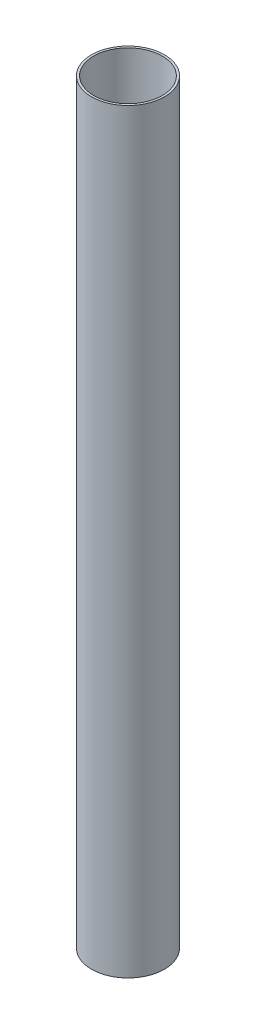
ISO-10303-21;
HEADER;
FILE_DESCRIPTION(('STEP AP214'),'2;1');
FILE_NAME('part.step','',(''),(''),'','','');
FILE_SCHEMA(('AUTOMOTIVE_DESIGN { 1 0 10303 214 1 1 1 1 }'));
ENDSEC;
DATA;
#1=APPLICATION_CONTEXT('core data for automotive mechanical design processes');
#2=APPLICATION_PROTOCOL_DEFINITION('international standard','automotive_design',2000,#1);
#3=PRODUCT_CONTEXT('',#1,'mechanical');
#4=PRODUCT('Part','Part','',(#3));
#5=PRODUCT_RELATED_PRODUCT_CATEGORY('part','',(#4));
#6=PRODUCT_DEFINITION_FORMATION('','',#4);
#7=PRODUCT_DEFINITION_CONTEXT('part definition',#1,'design');
#8=PRODUCT_DEFINITION('design','',#6,#7);
#9=PRODUCT_DEFINITION_SHAPE('','',#8);
#10=(LENGTH_UNIT() NAMED_UNIT(*) SI_UNIT(.MILLI.,.METRE.));
#11=(NAMED_UNIT(*) PLANE_ANGLE_UNIT() SI_UNIT($,.RADIAN.));
#12=(NAMED_UNIT(*) SI_UNIT($,.STERADIAN.) SOLID_ANGLE_UNIT());
#13=UNCERTAINTY_MEASURE_WITH_UNIT(LENGTH_MEASURE(1.E-05),#10,'distance_accuracy_value','');
#14=(GEOMETRIC_REPRESENTATION_CONTEXT(3) GLOBAL_UNCERTAINTY_ASSIGNED_CONTEXT((#13)) GLOBAL_UNIT_ASSIGNED_CONTEXT((#10,
#11,#12)) REPRESENTATION_CONTEXT('',''));
#15=CARTESIAN_POINT('',(0.,0.,0.));
#16=DIRECTION('',(0.,0.,1.));
#17=DIRECTION('',(1.,0.,0.));
#18=AXIS2_PLACEMENT_3D('',#15,#16,#17);
#19=CARTESIAN_POINT('',(0.,1146.81,0.));
#20=DIRECTION('',(0.,1.,0.));
#21=DIRECTION('',(0.,0.,1.));
#22=AXIS2_PLACEMENT_3D('',#19,#20,#21);
#23=CYLINDRICAL_SURFACE('',#22,49.5299999999999);
#24=CARTESIAN_POINT('',(0.,0.,0.));
#25=DIRECTION('',(0.,1.,0.));
#26=DIRECTION('',(0.,0.,1.));
#27=AXIS2_PLACEMENT_3D('',#24,#25,#26);
#28=CIRCLE('',#27,49.53);
#29=CARTESIAN_POINT('',(0.,0.,49.53));
#30=VERTEX_POINT('',#29);
#31=EDGE_CURVE('E10',#30,#30,#28,.T.);
#32=ORIENTED_EDGE('',*,*,#31,.F.);
#33=EDGE_LOOP('',(#32));
#34=FACE_BOUND('',#33,.T.);
#35=CARTESIAN_POINT('',(0.,1092.2,0.));
#36=DIRECTION('',(0.,1.,0.));
#37=DIRECTION('',(0.,0.,1.));
#38=AXIS2_PLACEMENT_3D('',#35,#36,#37);
#39=CIRCLE('',#38,49.5299999999999);
#40=CARTESIAN_POINT('',(0.,1092.2,49.5299999999999));
#41=VERTEX_POINT('',#40);
#42=EDGE_CURVE('E57',#41,#41,#39,.T.);
#43=ORIENTED_EDGE('',*,*,#42,.T.);
#44=EDGE_LOOP('',(#43));
#45=FACE_BOUND('',#44,.T.);
#46=ADVANCED_FACE('F40',(#34,#45),#23,.F.);
#47=CARTESIAN_POINT('',(49.53,0.,0.));
#48=DIRECTION('',(0.,1.,0.));
#49=DIRECTION('',(0.,0.,1.));
#50=AXIS2_PLACEMENT_3D('',#47,#48,#49);
#51=PLANE('',#50);
#52=CARTESIAN_POINT('',(0.,0.,0.));
#53=DIRECTION('',(0.,1.,0.));
#54=DIRECTION('',(0.,0.,1.));
#55=AXIS2_PLACEMENT_3D('',#52,#53,#54);
#56=CIRCLE('',#55,52.705);
#57=CARTESIAN_POINT('',(0.,0.,52.705));
#58=VERTEX_POINT('',#57);
#59=EDGE_CURVE('E47',#58,#58,#56,.T.);
#60=ORIENTED_EDGE('',*,*,#59,.F.);
#61=EDGE_LOOP('',(#60));
#62=FACE_BOUND('',#61,.T.);
#63=ORIENTED_EDGE('',*,*,#31,.T.);
#64=EDGE_LOOP('',(#63));
#65=FACE_BOUND('',#64,.T.);
#66=ADVANCED_FACE('F73',(#62,#65),#51,.F.);
#67=CARTESIAN_POINT('',(0.,1146.81,0.));
#68=DIRECTION('',(0.,1.,0.));
#69=DIRECTION('',(0.,0.,1.));
#70=AXIS2_PLACEMENT_3D('',#67,#68,#69);
#71=CYLINDRICAL_SURFACE('',#70,52.7049999999999);
#72=CARTESIAN_POINT('',(0.,1092.2,0.));
#73=DIRECTION('',(0.,1.,0.));
#74=DIRECTION('',(0.,0.,1.));
#75=AXIS2_PLACEMENT_3D('',#72,#73,#74);
#76=CIRCLE('',#75,52.7049999999999);
#77=CARTESIAN_POINT('',(0.,1092.2,52.7049999999999));
#78=VERTEX_POINT('',#77);
#79=EDGE_CURVE('E52',#78,#78,#76,.T.);
#80=ORIENTED_EDGE('',*,*,#79,.F.);
#81=EDGE_LOOP('',(#80));
#82=FACE_BOUND('',#81,.T.);
#83=ORIENTED_EDGE('',*,*,#59,.T.);
#84=EDGE_LOOP('',(#83));
#85=FACE_BOUND('',#84,.T.);
#86=ADVANCED_FACE('F68',(#82,#85),#71,.T.);
#87=CARTESIAN_POINT('',(49.5299999999999,1092.2,0.));
#88=DIRECTION('',(0.,-1.,0.));
#89=DIRECTION('',(0.,0.,-1.));
#90=AXIS2_PLACEMENT_3D('',#87,#88,#89);
#91=PLANE('',#90);
#92=ORIENTED_EDGE('',*,*,#42,.F.);
#93=EDGE_LOOP('',(#92));
#94=FACE_BOUND('',#93,.T.);
#95=ORIENTED_EDGE('',*,*,#79,.T.);
#96=EDGE_LOOP('',(#95));
#97=FACE_BOUND('',#96,.T.);
#98=ADVANCED_FACE('F65',(#94,#97),#91,.F.);
#99=CLOSED_SHELL('',(#46,#66,#86,#98));
#100=MANIFOLD_SOLID_BREP('B2',#99);
#101=ADVANCED_BREP_SHAPE_REPRESENTATION('',(#18,#100),#14);
#102=SHAPE_DEFINITION_REPRESENTATION(#9,#101);
ENDSEC;
END-ISO-10303-21;
